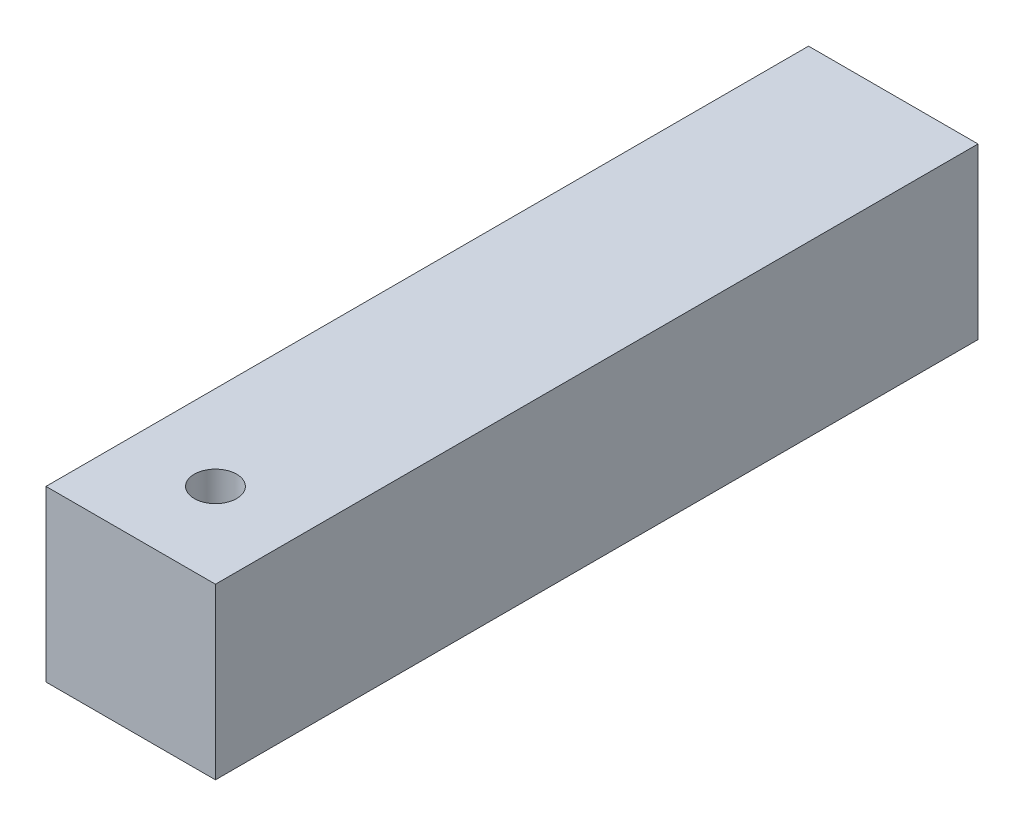
ISO-10303-21;
HEADER;
FILE_DESCRIPTION(('STEP AP214'),'2;1');
FILE_NAME('part.step','',(''),(''),'','','');
FILE_SCHEMA(('AUTOMOTIVE_DESIGN { 1 0 10303 214 1 1 1 1 }'));
ENDSEC;
DATA;
#1=APPLICATION_CONTEXT('core data for automotive mechanical design processes');
#2=APPLICATION_PROTOCOL_DEFINITION('international standard','automotive_design',2000,#1);
#3=PRODUCT_CONTEXT('',#1,'mechanical');
#4=PRODUCT('Part','Part','',(#3));
#5=PRODUCT_RELATED_PRODUCT_CATEGORY('part','',(#4));
#6=PRODUCT_DEFINITION_FORMATION('','',#4);
#7=PRODUCT_DEFINITION_CONTEXT('part definition',#1,'design');
#8=PRODUCT_DEFINITION('design','',#6,#7);
#9=PRODUCT_DEFINITION_SHAPE('','',#8);
#10=(LENGTH_UNIT() NAMED_UNIT(*) SI_UNIT(.MILLI.,.METRE.));
#11=(NAMED_UNIT(*) PLANE_ANGLE_UNIT() SI_UNIT($,.RADIAN.));
#12=(NAMED_UNIT(*) SI_UNIT($,.STERADIAN.) SOLID_ANGLE_UNIT());
#13=UNCERTAINTY_MEASURE_WITH_UNIT(LENGTH_MEASURE(1.E-05),#10,'distance_accuracy_value','');
#14=(GEOMETRIC_REPRESENTATION_CONTEXT(3) GLOBAL_UNCERTAINTY_ASSIGNED_CONTEXT((#13)) GLOBAL_UNIT_ASSIGNED_CONTEXT((#10,
#11,#12)) REPRESENTATION_CONTEXT('',''));
#15=CARTESIAN_POINT('',(0.,0.,0.));
#16=DIRECTION('',(0.,0.,1.));
#17=DIRECTION('',(1.,0.,0.));
#18=AXIS2_PLACEMENT_3D('',#15,#16,#17);
#19=CARTESIAN_POINT('',(-50.,50.,-450.));
#20=DIRECTION('',(-1.,0.,0.));
#21=DIRECTION('',(0.,-1.,0.));
#22=AXIS2_PLACEMENT_3D('',#19,#20,#21);
#23=PLANE('',#22);
#24=DIRECTION('',(0.,-1.,0.));
#25=VECTOR('',#24,1.);
#26=CARTESIAN_POINT('',(-50.,50.,0.));
#27=LINE('',#26,#25);
#28=CARTESIAN_POINT('',(-50.,50.,0.));
#29=VERTEX_POINT('',#28);
#30=CARTESIAN_POINT('',(-50.,-50.,0.));
#31=VERTEX_POINT('',#30);
#32=EDGE_CURVE('E118',#29,#31,#27,.T.);
#33=ORIENTED_EDGE('',*,*,#32,.F.);
#34=DIRECTION('',(0.,0.,1.));
#35=VECTOR('',#34,1.);
#36=CARTESIAN_POINT('',(-50.,50.,-450.));
#37=LINE('',#36,#35);
#38=CARTESIAN_POINT('',(-50.,50.,-450.));
#39=VERTEX_POINT('',#38);
#40=EDGE_CURVE('E11',#39,#29,#37,.T.);
#41=ORIENTED_EDGE('',*,*,#40,.F.);
#42=DIRECTION('',(0.,-1.,0.));
#43=VECTOR('',#42,1.);
#44=CARTESIAN_POINT('',(-50.,50.,-450.));
#45=LINE('',#44,#43);
#46=CARTESIAN_POINT('',(-50.,-50.,-450.));
#47=VERTEX_POINT('',#46);
#48=EDGE_CURVE('E109',#39,#47,#45,.T.);
#49=ORIENTED_EDGE('',*,*,#48,.T.);
#50=DIRECTION('',(0.,0.,1.));
#51=VECTOR('',#50,1.);
#52=CARTESIAN_POINT('',(-50.,-50.,-450.));
#53=LINE('',#52,#51);
#54=EDGE_CURVE('E89',#47,#31,#53,.T.);
#55=ORIENTED_EDGE('',*,*,#54,.T.);
#56=EDGE_LOOP('',(#33,#41,#49,#55));
#57=FACE_BOUND('',#56,.T.);
#58=ADVANCED_FACE('F45',(#57),#23,.T.);
#59=CARTESIAN_POINT('',(50.,50.,-450.));
#60=DIRECTION('',(0.,1.,0.));
#61=DIRECTION('',(-1.,0.,0.));
#62=AXIS2_PLACEMENT_3D('',#59,#60,#61);
#63=PLANE('',#62);
#64=CARTESIAN_POINT('',(0.,50.,-50.));
#65=DIRECTION('',(0.,1.,0.));
#66=DIRECTION('',(-1.,0.,0.));
#67=AXIS2_PLACEMENT_3D('',#64,#65,#66);
#68=CIRCLE('',#67,12.5);
#69=CARTESIAN_POINT('',(-12.5,50.,-50.));
#70=VERTEX_POINT('',#69);
#71=EDGE_CURVE('E157',#70,#70,#68,.T.);
#72=ORIENTED_EDGE('',*,*,#71,.F.);
#73=EDGE_LOOP('',(#72));
#74=FACE_BOUND('',#73,.T.);
#75=DIRECTION('',(-1.,0.,0.));
#76=VECTOR('',#75,1.);
#77=CARTESIAN_POINT('',(50.,50.,0.));
#78=LINE('',#77,#76);
#79=CARTESIAN_POINT('',(50.,50.,0.));
#80=VERTEX_POINT('',#79);
#81=EDGE_CURVE('E112',#80,#29,#78,.T.);
#82=ORIENTED_EDGE('',*,*,#81,.F.);
#83=DIRECTION('',(0.,0.,1.));
#84=VECTOR('',#83,1.);
#85=CARTESIAN_POINT('',(50.,50.,-450.));
#86=LINE('',#85,#84);
#87=CARTESIAN_POINT('',(50.,50.,-450.));
#88=VERTEX_POINT('',#87);
#89=EDGE_CURVE('E55',#88,#80,#86,.T.);
#90=ORIENTED_EDGE('',*,*,#89,.F.);
#91=DIRECTION('',(-1.,0.,0.));
#92=VECTOR('',#91,1.);
#93=CARTESIAN_POINT('',(50.,50.,-450.));
#94=LINE('',#93,#92);
#95=EDGE_CURVE('E104',#88,#39,#94,.T.);
#96=ORIENTED_EDGE('',*,*,#95,.T.);
#97=ORIENTED_EDGE('',*,*,#40,.T.);
#98=EDGE_LOOP('',(#82,#90,#96,#97));
#99=FACE_BOUND('',#98,.T.);
#100=ADVANCED_FACE('F134',(#74,#99),#63,.T.);
#101=CARTESIAN_POINT('',(50.,50.,-450.));
#102=DIRECTION('',(1.,0.,0.));
#103=DIRECTION('',(0.,1.,0.));
#104=AXIS2_PLACEMENT_3D('',#101,#102,#103);
#105=PLANE('',#104);
#106=DIRECTION('',(0.,1.,0.));
#107=VECTOR('',#106,1.);
#108=CARTESIAN_POINT('',(50.,50.,0.));
#109=LINE('',#108,#107);
#110=CARTESIAN_POINT('',(50.,-50.,0.));
#111=VERTEX_POINT('',#110);
#112=EDGE_CURVE('E97',#111,#80,#109,.T.);
#113=ORIENTED_EDGE('',*,*,#112,.F.);
#114=DIRECTION('',(0.,0.,1.));
#115=VECTOR('',#114,1.);
#116=CARTESIAN_POINT('',(50.,-50.,-450.));
#117=LINE('',#116,#115);
#118=CARTESIAN_POINT('',(50.,-50.,-450.));
#119=VERTEX_POINT('',#118);
#120=EDGE_CURVE('E92',#119,#111,#117,.T.);
#121=ORIENTED_EDGE('',*,*,#120,.F.);
#122=DIRECTION('',(0.,1.,0.));
#123=VECTOR('',#122,1.);
#124=CARTESIAN_POINT('',(50.,50.,-450.));
#125=LINE('',#124,#123);
#126=EDGE_CURVE('E95',#119,#88,#125,.T.);
#127=ORIENTED_EDGE('',*,*,#126,.T.);
#128=ORIENTED_EDGE('',*,*,#89,.T.);
#129=EDGE_LOOP('',(#113,#121,#127,#128));
#130=FACE_BOUND('',#129,.T.);
#131=ADVANCED_FACE('F94',(#130),#105,.T.);
#132=CARTESIAN_POINT('',(50.,-50.,-450.));
#133=DIRECTION('',(0.,-1.,0.));
#134=DIRECTION('',(1.,0.,0.));
#135=AXIS2_PLACEMENT_3D('',#132,#133,#134);
#136=PLANE('',#135);
#137=CARTESIAN_POINT('',(0.,-50.,-50.));
#138=DIRECTION('',(0.,-1.,0.));
#139=DIRECTION('',(1.,0.,0.));
#140=AXIS2_PLACEMENT_3D('',#137,#138,#139);
#141=CIRCLE('',#140,12.5);
#142=CARTESIAN_POINT('',(12.5000000000001,-50.,-50.));
#143=VERTEX_POINT('',#142);
#144=EDGE_CURVE('E48',#143,#143,#141,.T.);
#145=ORIENTED_EDGE('',*,*,#144,.F.);
#146=EDGE_LOOP('',(#145));
#147=FACE_BOUND('',#146,.T.);
#148=DIRECTION('',(1.,0.,0.));
#149=VECTOR('',#148,1.);
#150=CARTESIAN_POINT('',(50.,-50.,0.));
#151=LINE('',#150,#149);
#152=EDGE_CURVE('E122',#31,#111,#151,.T.);
#153=ORIENTED_EDGE('',*,*,#152,.F.);
#154=ORIENTED_EDGE('',*,*,#54,.F.);
#155=DIRECTION('',(1.,0.,0.));
#156=VECTOR('',#155,1.);
#157=CARTESIAN_POINT('',(50.,-50.,-450.));
#158=LINE('',#157,#156);
#159=EDGE_CURVE('E103',#47,#119,#158,.T.);
#160=ORIENTED_EDGE('',*,*,#159,.T.);
#161=ORIENTED_EDGE('',*,*,#120,.T.);
#162=EDGE_LOOP('',(#153,#154,#160,#161));
#163=FACE_BOUND('',#162,.T.);
#164=ADVANCED_FACE('F107',(#147,#163),#136,.T.);
#165=CARTESIAN_POINT('',(0.,0.,-450.));
#166=DIRECTION('',(0.,0.,-1.));
#167=DIRECTION('',(-1.,0.,0.));
#168=AXIS2_PLACEMENT_3D('',#165,#166,#167);
#169=PLANE('',#168);
#170=ORIENTED_EDGE('',*,*,#48,.F.);
#171=ORIENTED_EDGE('',*,*,#95,.F.);
#172=ORIENTED_EDGE('',*,*,#126,.F.);
#173=ORIENTED_EDGE('',*,*,#159,.F.);
#174=EDGE_LOOP('',(#170,#171,#172,#173));
#175=FACE_BOUND('',#174,.T.);
#176=ADVANCED_FACE('F102',(#175),#169,.T.);
#177=CARTESIAN_POINT('',(0.,0.,0.));
#178=DIRECTION('',(0.,0.,-1.));
#179=DIRECTION('',(-1.,0.,0.));
#180=AXIS2_PLACEMENT_3D('',#177,#178,#179);
#181=PLANE('',#180);
#182=ORIENTED_EDGE('',*,*,#32,.T.);
#183=ORIENTED_EDGE('',*,*,#152,.T.);
#184=ORIENTED_EDGE('',*,*,#112,.T.);
#185=ORIENTED_EDGE('',*,*,#81,.T.);
#186=EDGE_LOOP('',(#182,#183,#184,#185));
#187=FACE_BOUND('',#186,.T.);
#188=ADVANCED_FACE('F133',(#187),#181,.F.);
#189=CARTESIAN_POINT('',(0.,-450.,-50.));
#190=DIRECTION('',(0.,1.,0.));
#191=DIRECTION('',(-1.,0.,0.));
#192=AXIS2_PLACEMENT_3D('',#189,#190,#191);
#193=CYLINDRICAL_SURFACE('',#192,12.5);
#194=ORIENTED_EDGE('',*,*,#144,.T.);
#195=EDGE_LOOP('',(#194));
#196=FACE_BOUND('',#195,.T.);
#197=ORIENTED_EDGE('',*,*,#71,.T.);
#198=EDGE_LOOP('',(#197));
#199=FACE_BOUND('',#198,.T.);
#200=ADVANCED_FACE('F161',(#196,#199),#193,.F.);
#201=CLOSED_SHELL('',(#58,#100,#131,#164,#176,#188,#200));
#202=MANIFOLD_SOLID_BREP('B2',#201);
#203=ADVANCED_BREP_SHAPE_REPRESENTATION('',(#18,#202),#14);
#204=SHAPE_DEFINITION_REPRESENTATION(#9,#203);
ENDSEC;
END-ISO-10303-21;
